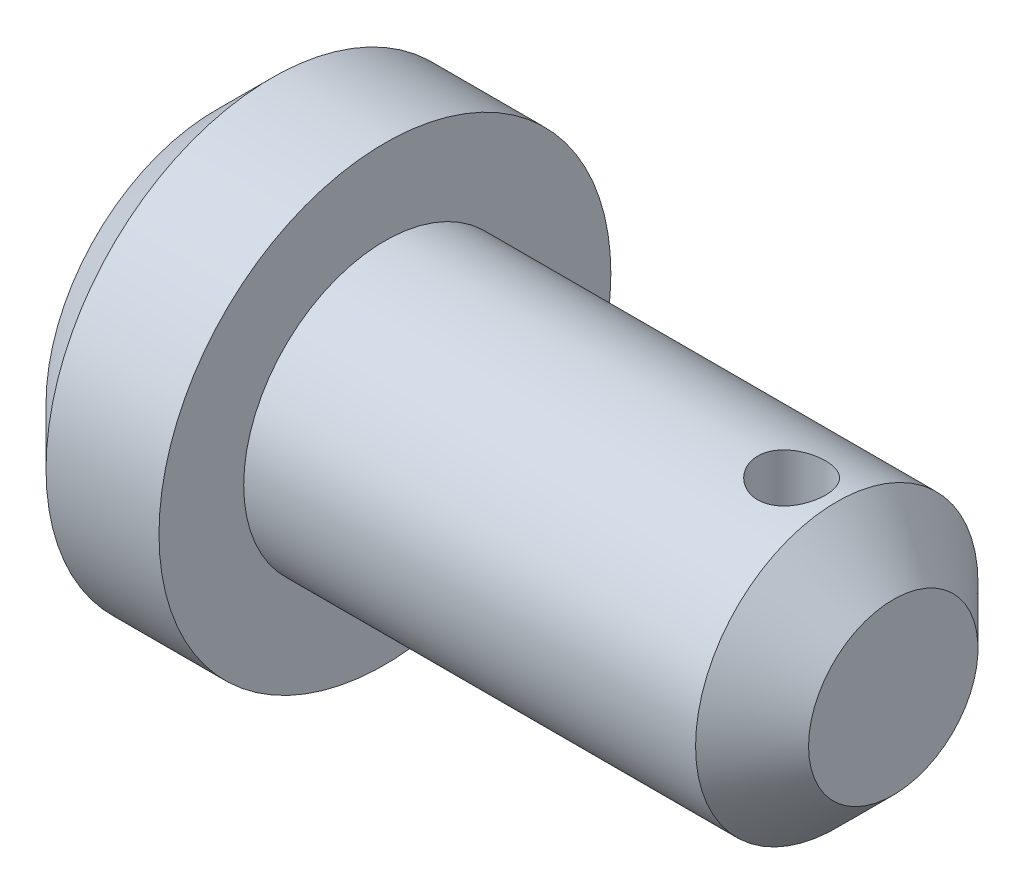
ISO-10303-21;
HEADER;
FILE_DESCRIPTION(('STEP AP214'),'2;1');
FILE_NAME('part.step','',(''),(''),'','','');
FILE_SCHEMA(('AUTOMOTIVE_DESIGN { 1 0 10303 214 1 1 1 1 }'));
ENDSEC;
DATA;
#1=APPLICATION_CONTEXT('core data for automotive mechanical design processes');
#2=APPLICATION_PROTOCOL_DEFINITION('international standard','automotive_design',2000,#1);
#3=PRODUCT_CONTEXT('',#1,'mechanical');
#4=PRODUCT('Part','Part','',(#3));
#5=PRODUCT_RELATED_PRODUCT_CATEGORY('part','',(#4));
#6=PRODUCT_DEFINITION_FORMATION('','',#4);
#7=PRODUCT_DEFINITION_CONTEXT('part definition',#1,'design');
#8=PRODUCT_DEFINITION('design','',#6,#7);
#9=PRODUCT_DEFINITION_SHAPE('','',#8);
#10=(LENGTH_UNIT() NAMED_UNIT(*) SI_UNIT(.MILLI.,.METRE.));
#11=(NAMED_UNIT(*) PLANE_ANGLE_UNIT() SI_UNIT($,.RADIAN.));
#12=(NAMED_UNIT(*) SI_UNIT($,.STERADIAN.) SOLID_ANGLE_UNIT());
#13=UNCERTAINTY_MEASURE_WITH_UNIT(LENGTH_MEASURE(1.E-05),#10,'distance_accuracy_value','');
#14=(GEOMETRIC_REPRESENTATION_CONTEXT(3) GLOBAL_UNCERTAINTY_ASSIGNED_CONTEXT((#13)) GLOBAL_UNIT_ASSIGNED_CONTEXT((#10,
#11,#12)) REPRESENTATION_CONTEXT('',''));
#15=CARTESIAN_POINT('',(0.,0.,0.));
#16=DIRECTION('',(0.,0.,1.));
#17=DIRECTION('',(1.,0.,0.));
#18=AXIS2_PLACEMENT_3D('',#15,#16,#17);
#19=CARTESIAN_POINT('',(-58.2352941176471,30.,0.));
#20=DIRECTION('',(1.,0.,0.));
#21=DIRECTION('',(0.,0.,-1.));
#22=AXIS2_PLACEMENT_3D('',#19,#20,#21);
#23=PLANE('',#22);
#24=CARTESIAN_POINT('',(-58.235294117647,0.,0.));
#25=DIRECTION('',(-1.,0.,0.));
#26=DIRECTION('',(0.,0.,1.));
#27=AXIS2_PLACEMENT_3D('',#24,#25,#26);
#28=CIRCLE('',#27,30.);
#29=CARTESIAN_POINT('',(-58.235294117647,0.,30.));
#30=VERTEX_POINT('',#29);
#31=EDGE_CURVE('E110',#30,#30,#28,.T.);
#32=ORIENTED_EDGE('',*,*,#31,.T.);
#33=EDGE_LOOP('',(#32));
#34=FACE_BOUND('',#33,.T.);
#35=ADVANCED_FACE('F45',(#34),#23,.F.);
#36=CARTESIAN_POINT('',(61.764705882353,0.,0.));
#37=DIRECTION('',(-1.,0.,0.));
#38=DIRECTION('',(0.,0.,1.));
#39=AXIS2_PLACEMENT_3D('',#36,#37,#38);
#40=PLANE('',#39);
#41=CARTESIAN_POINT('',(61.764705882353,0.,0.));
#42=DIRECTION('',(-1.,0.,0.));
#43=DIRECTION('',(0.,0.,1.));
#44=AXIS2_PLACEMENT_3D('',#41,#42,#43);
#45=CIRCLE('',#44,15.);
#46=CARTESIAN_POINT('',(61.764705882353,0.,15.));
#47=VERTEX_POINT('',#46);
#48=EDGE_CURVE('E10',#47,#47,#45,.T.);
#49=ORIENTED_EDGE('',*,*,#48,.F.);
#50=EDGE_LOOP('',(#49));
#51=FACE_BOUND('',#50,.T.);
#52=ADVANCED_FACE('F102',(#51),#40,.F.);
#53=CARTESIAN_POINT('',(61.764705882353,0.,0.));
#54=DIRECTION('',(-1.,0.,0.));
#55=DIRECTION('',(0.,0.,1.));
#56=AXIS2_PLACEMENT_3D('',#53,#54,#55);
#57=CONICAL_SURFACE('',#56,15.,0.785398163397449);
#58=CARTESIAN_POINT('',(51.764705882353,0.,0.));
#59=DIRECTION('',(-1.,0.,0.));
#60=DIRECTION('',(0.,0.,1.));
#61=AXIS2_PLACEMENT_3D('',#58,#59,#60);
#62=CIRCLE('',#61,25.);
#63=CARTESIAN_POINT('',(51.764705882353,0.,25.));
#64=VERTEX_POINT('',#63);
#65=EDGE_CURVE('E58',#64,#64,#62,.T.);
#66=ORIENTED_EDGE('',*,*,#65,.F.);
#67=EDGE_LOOP('',(#66));
#68=FACE_BOUND('',#67,.T.);
#69=ORIENTED_EDGE('',*,*,#48,.T.);
#70=EDGE_LOOP('',(#69));
#71=FACE_BOUND('',#70,.T.);
#72=ADVANCED_FACE('F97',(#68,#71),#57,.T.);
#73=CARTESIAN_POINT('',(-58.2352941176471,0.,0.));
#74=DIRECTION('',(-1.,0.,0.));
#75=DIRECTION('',(0.,0.,1.));
#76=AXIS2_PLACEMENT_3D('',#73,#74,#75);
#77=CYLINDRICAL_SURFACE('',#76,25.);
#78=CARTESIAN_POINT('',(43.764705882353,-24.2693221990232,6.));
#79=CARTESIAN_POINT('',(43.9306461499323,-24.2693192173439,6.00000460058749));
#80=CARTESIAN_POINT('',(44.0965349544905,-24.2710270328908,5.99311472313627));
#81=CARTESIAN_POINT('',(44.4271510845846,-24.2777997433195,5.96562344868169));
#82=CARTESIAN_POINT('',(44.5918782603941,-24.2828650632483,5.94502031563237));
#83=CARTESIAN_POINT('',(44.9189848875476,-24.2962060432289,5.89025958920488));
#84=CARTESIAN_POINT('',(45.081363459721,-24.304482874777,5.85609704951731));
#85=CARTESIAN_POINT('',(45.4026282056471,-24.324002012079,5.77448580831014));
#86=CARTESIAN_POINT('',(45.561513065448,-24.3352454135442,5.72703219729494));
#87=CARTESIAN_POINT('',(45.8743714150501,-24.360345033975,5.61930954739399));
#88=CARTESIAN_POINT('',(46.0283524441402,-24.3741969907612,5.55906139358703));
#89=CARTESIAN_POINT('',(46.3306948292698,-24.4041320001377,5.42613868912028));
#90=CARTESIAN_POINT('',(46.4790540846896,-24.420215876438,5.35345954837854));
#91=CARTESIAN_POINT('',(46.7690675207731,-24.4541500249133,5.19624934621714));
#92=CARTESIAN_POINT('',(46.9107241861786,-24.471999634801,5.11172272360157));
#93=CARTESIAN_POINT('',(47.1865364336345,-24.5089827826596,4.93135257338601));
#94=CARTESIAN_POINT('',(47.3206891710384,-24.5281168015673,4.83550479634857));
#95=CARTESIAN_POINT('',(47.5829186525761,-24.5674915774464,4.63134479435269));
#96=CARTESIAN_POINT('',(47.7108434537073,-24.5877460219987,4.52284000132129));
#97=CARTESIAN_POINT('',(47.9571904319463,-24.628482704143,4.29548353417838));
#98=CARTESIAN_POINT('',(48.0756090652001,-24.6489650234755,4.17662803548194));
#99=CARTESIAN_POINT('',(48.3020765677449,-24.6895792444555,3.92942214664514));
#100=CARTESIAN_POINT('',(48.4101282952854,-24.7097112414296,3.80107439098764));
#101=CARTESIAN_POINT('',(48.6152046472597,-24.749084932891,3.53564701496838));
#102=CARTESIAN_POINT('',(48.7122251948699,-24.7683262966769,3.39856419538247));
#103=CARTESIAN_POINT('',(48.8956503307429,-24.805612728147,3.11485061597086));
#104=CARTESIAN_POINT('',(48.9819076047794,-24.8236399057151,2.96812218206264));
#105=CARTESIAN_POINT('',(49.1417592916474,-24.8577272433076,2.66763492888514));
#106=CARTESIAN_POINT('',(49.2153489250682,-24.8737866602544,2.51387348368351));
#107=CARTESIAN_POINT('',(49.3492191485298,-24.9034639147108,2.20050084057474));
#108=CARTESIAN_POINT('',(49.4095060792765,-24.917082914856,2.04089247207776));
#109=CARTESIAN_POINT('',(49.5163409431724,-24.9415044760467,1.71693448898556));
#110=CARTESIAN_POINT('',(49.5628839311911,-24.9523060231976,1.55258319115473));
#111=CARTESIAN_POINT('',(49.6797147224069,-24.9796180760798,1.06042675145321));
#112=CARTESIAN_POINT('',(49.7298815358237,-24.9916494382249,0.727223064781644));
#113=CARTESIAN_POINT('',(49.7628460600211,-24.9995546719704,0.225051972672744));
#114=CARTESIAN_POINT('',(49.7667798362233,-25.0004978214515,0.0572008556931702));
#115=CARTESIAN_POINT('',(49.7605958457296,-24.9990135577545,-0.278247999700315));
#116=CARTESIAN_POINT('',(49.750477905138,-24.9965861028638,-0.445845734952831));
#117=CARTESIAN_POINT('',(49.6997801568796,-24.9844710986104,-0.939451198306497));
#118=CARTESIAN_POINT('',(49.6393121632639,-24.9700581884779,-1.26352376365918));
#119=CARTESIAN_POINT('',(49.4665219571564,-24.9299774285752,-1.8966100087818));
#120=CARTESIAN_POINT('',(49.3541971112851,-24.9043090072343,-2.20562292291579));
#121=CARTESIAN_POINT('',(49.0799323387454,-24.8441871252282,-2.80308340285013));
#122=CARTESIAN_POINT('',(48.9175794035077,-24.8096609520016,-3.09133416391587));
#123=CARTESIAN_POINT('',(48.5481789823236,-24.7355808399422,-3.63689114777194));
#124=CARTESIAN_POINT('',(48.341124271936,-24.6960260888452,-3.89419235819687));
#125=CARTESIAN_POINT('',(47.8820750892758,-24.6150468786432,-4.37733250714646));
#126=CARTESIAN_POINT('',(47.6290871524865,-24.5736003966327,-4.60222487048294));
#127=CARTESIAN_POINT('',(47.0885546075646,-24.4944202534268,-5.00659136952867));
#128=CARTESIAN_POINT('',(46.8010086337529,-24.4566867390692,-5.18606370943939));
#129=CARTESIAN_POINT('',(46.1977753706163,-24.3891322466935,-5.4950396533725));
#130=CARTESIAN_POINT('',(45.8819757808872,-24.3593449045093,-5.62433186444417));
#131=CARTESIAN_POINT('',(45.2322396349259,-24.3114966451334,-5.82770650444349));
#132=CARTESIAN_POINT('',(44.8983066314554,-24.2934334398264,-5.90179970658057));
#133=CARTESIAN_POINT('',(44.2305191237201,-24.2715545321338,-5.99113700492853));
#134=CARTESIAN_POINT('',(43.8968617428008,-24.2674017566251,-6.00777368474904));
#135=CARTESIAN_POINT('',(43.2315394887343,-24.2728991225919,-5.98552405004056));
#136=CARTESIAN_POINT('',(42.8998744503728,-24.2825481032417,-5.9466424049974));
#137=CARTESIAN_POINT('',(42.2530140679022,-24.3142403018894,-5.81567711192227));
#138=CARTESIAN_POINT('',(41.9376476049011,-24.3360979424442,-5.7243894954131));
#139=CARTESIAN_POINT('',(41.3266901666286,-24.3895714349639,-5.49207803402932));
#140=CARTESIAN_POINT('',(41.0311013939784,-24.421188371618,-5.35104866039818));
#141=CARTESIAN_POINT('',(40.4621486605068,-24.491337816706,-5.0202958832683));
#142=CARTESIAN_POINT('',(40.1892881977641,-24.5299859071541,-4.82973151657672));
#143=CARTESIAN_POINT('',(39.6789033509813,-24.609553113729,-4.40637723136317));
#144=CARTESIAN_POINT('',(39.4413843083727,-24.6504725718652,-4.17358094176829));
#145=CARTESIAN_POINT('',(39.0028799259293,-24.7311017019711,-3.66607172916322));
#146=CARTESIAN_POINT('',(38.8028536945154,-24.770762345906,-3.3905223617437));
#147=CARTESIAN_POINT('',(38.4518736328202,-24.8434406642277,-2.80874047615626));
#148=CARTESIAN_POINT('',(38.300917307953,-24.8764586762762,-2.50250951879602));
#149=CARTESIAN_POINT('',(38.1153414299562,-24.9181020803639,-2.02815096730083));
#150=CARTESIAN_POINT('',(38.0603976383018,-24.9306431435962,-1.86803584664665));
#151=CARTESIAN_POINT('',(37.9641905159392,-24.9528307363167,-1.5435669629554));
#152=CARTESIAN_POINT('',(37.9229220563691,-24.9624783508485,-1.37921481397561));
#153=CARTESIAN_POINT('',(37.8544155710539,-24.9785993962541,-1.04746058126016));
#154=CARTESIAN_POINT('',(37.8271782543408,-24.9850726667189,-0.880058343837646));
#155=CARTESIAN_POINT('',(37.7869656967812,-24.9946592960451,-0.543455945222837));
#156=CARTESIAN_POINT('',(37.7739898435932,-24.997772799164,-0.374255861539258));
#157=CARTESIAN_POINT('',(37.7625588715036,-25.0005148115007,-0.0395721662636039));
#158=CARTESIAN_POINT('',(37.7637493121304,-25.0002283873103,0.125898766906475));
#159=CARTESIAN_POINT('',(37.7797859816443,-24.9963838456846,0.456136647513654));
#160=CARTESIAN_POINT('',(37.7946319142076,-24.9928257992435,0.620903610148951));
#161=CARTESIAN_POINT('',(37.8378586224235,-24.9825354772041,0.948575696498024));
#162=CARTESIAN_POINT('',(37.866241434379,-24.9758027240481,1.11148053632312));
#163=CARTESIAN_POINT('',(37.9362970722175,-24.9593507893913,1.43419100404799));
#164=CARTESIAN_POINT('',(37.9779651863338,-24.9496326667266,1.59399770944887));
#165=CARTESIAN_POINT('',(38.074055129064,-24.9275215666658,1.90878490028135));
#166=CARTESIAN_POINT('',(38.1284215653486,-24.9151402247435,2.06378312590838));
#167=CARTESIAN_POINT('',(38.2495670294664,-24.8880146824749,2.3685707959777));
#168=CARTESIAN_POINT('',(38.3163417194494,-24.8732713081285,2.51836203909182));
#169=CARTESIAN_POINT('',(38.4618583151318,-24.841802398867,2.81187682420641));
#170=CARTESIAN_POINT('',(38.5406054199167,-24.8250760035128,2.95559769529925));
#171=CARTESIAN_POINT('',(38.7094625725609,-24.7900921246488,3.23593617076045));
#172=CARTESIAN_POINT('',(38.7995688389214,-24.7718351513474,3.37255611776949));
#173=CARTESIAN_POINT('',(38.9927284597949,-24.7338351675459,3.64090348698623));
#174=CARTESIAN_POINT('',(39.0960293956952,-24.7140678232284,3.77244930795077));
#175=CARTESIAN_POINT('',(39.3131611130006,-24.6739715765701,4.02636882328124));
#176=CARTESIAN_POINT('',(39.4269882762308,-24.6536428688592,4.14874564331391));
#177=CARTESIAN_POINT('',(39.6645212729517,-24.6129603609016,4.38365180469934));
#178=CARTESIAN_POINT('',(39.7882330139467,-24.5926065529162,4.49617517167718));
#179=CARTESIAN_POINT('',(40.0446205206804,-24.5524543239015,4.71050671781096));
#180=CARTESIAN_POINT('',(40.1772930120758,-24.532655703704,4.81231877656933));
#181=CARTESIAN_POINT('',(40.4531432558612,-24.4938254842292,5.00624248933444));
#182=CARTESIAN_POINT('',(40.5964627458547,-24.474813007441,5.09815651544129));
#183=CARTESIAN_POINT('',(40.8905001906618,-24.4384897622653,5.26952462166943));
#184=CARTESIAN_POINT('',(41.0412153967742,-24.4211783687267,5.34898328559685));
#185=CARTESIAN_POINT('',(41.3489885983494,-24.3887740639133,5.49484184745972));
#186=CARTESIAN_POINT('',(41.506043517432,-24.3736800927344,5.56124798952492));
#187=CARTESIAN_POINT('',(41.8253903644842,-24.3461620490209,5.6805037284954));
#188=CARTESIAN_POINT('',(41.9876814414929,-24.3337375451432,5.7333555158345));
#189=CARTESIAN_POINT('',(42.4137614795976,-24.3054947105592,5.85223691155717));
#190=CARTESIAN_POINT('',(42.6807794743786,-24.2920191452793,5.90755575023753));
#191=CARTESIAN_POINT('',(43.2201466900256,-24.2739356520306,5.98143220718613));
#192=CARTESIAN_POINT('',(43.4924955284105,-24.2693270902047,5.99999245314254));
#193=CARTESIAN_POINT('',(43.764705882353,-24.2693221990232,6.));
#194=B_SPLINE_CURVE_WITH_KNOTS('',3,(#78,#79,#80,#81,#82,#83,#84,#85,#86,#87,#88,#89,#90,#91,
#92,#93,#94,#95,#96,#97,#98,#99,#100,#101,#102,#103,#104,#105,#106,#107,#108,#109,#110,#111,
#112,#113,#114,#115,#116,#117,#118,#119,#120,#121,#122,#123,#124,#125,#126,#127,#128,#129,#130,
#131,#132,#133,#134,#135,#136,#137,#138,#139,#140,#141,#142,#143,#144,#145,#146,#147,#148,#149,
#150,#151,#152,#153,#154,#155,#156,#157,#158,#159,#160,#161,#162,#163,#164,#165,#166,#167,#168,
#169,#170,#171,#172,#173,#174,#175,#176,#177,#178,#179,#180,#181,#182,#183,#184,#185,#186,#187,
#188,#189,#190,#191,#192,#193),.UNSPECIFIED.,.T.,.F.,(4,2,2,2,2,2,2,2,2,2,2,2,2,2,2,2,2,2,2,2,2,
2,2,2,2,2,2,2,2,2,2,2,2,2,2,2,2,2,2,2,2,2,2,2,2,2,2,2,2,2,2,2,2,2,2,2,2,4),(0.,
0.497580591380397,0.995224186553663,1.49304948324961,1.99105891120688,2.48826158123243,
2.98564823885731,3.4828490401512,3.98023706425766,4.48653742340698,4.99302566076186,
5.49937385101409,6.00590856964271,6.51875380835026,7.03179211782623,7.5445853578556,
8.0575628789423,9.06317072582739,9.56637068685641,10.0695768752428,11.0544731736285,
12.0394194922331,13.0327253814724,14.0261919233719,15.0444773123883,16.0628029556731,
17.0853730875996,18.1077435918425,19.1051538629732,20.10248024975,21.0850439079104,
22.0677168116698,23.0683069952269,24.0690482527067,25.0926627677996,26.1162252368616,
26.624940138715,27.1334640332021,27.6420136222755,28.150541375013,28.6463730888495,
29.1421940434048,29.6380896060201,30.1338094895388,30.6274060608767,31.1208303973833,
31.6144696213305,32.1079449431356,32.6126284711583,33.1171391648262,33.6219536669565,
34.1265846927702,34.6399206216221,35.1530671874622,35.6659676710412,36.1787852157025,
36.9950805869967,37.8113176033061),.UNSPECIFIED.);
#195=CARTESIAN_POINT('',(43.764705882353,-24.2693221990232,6.));
#196=VERTEX_POINT('',#195);
#197=EDGE_CURVE('E48',#196,#196,#194,.T.);
#198=ORIENTED_EDGE('',*,*,#197,.T.);
#199=EDGE_LOOP('',(#198));
#200=FACE_BOUND('',#199,.T.);
#201=CARTESIAN_POINT('',(43.764705882353,24.2693221990232,6.));
#202=CARTESIAN_POINT('',(43.5987656147736,24.2693192173439,6.00000460058749));
#203=CARTESIAN_POINT('',(43.4328768102154,24.2710270328908,5.99311472313627));
#204=CARTESIAN_POINT('',(43.1022606801213,24.2777997433195,5.96562344868169));
#205=CARTESIAN_POINT('',(42.9375335043118,24.2828650632483,5.94502031563237));
#206=CARTESIAN_POINT('',(42.6104268771583,24.2962060432289,5.89025958920488));
#207=CARTESIAN_POINT('',(42.4480483049849,24.304482874777,5.85609704951731));
#208=CARTESIAN_POINT('',(42.1267835590588,24.324002012079,5.77448580831014));
#209=CARTESIAN_POINT('',(41.9678986992579,24.3352454135442,5.72703219729494));
#210=CARTESIAN_POINT('',(41.6550403496558,24.360345033975,5.61930954739399));
#211=CARTESIAN_POINT('',(41.5010593205657,24.3741969907612,5.55906139358703));
#212=CARTESIAN_POINT('',(41.1987169354361,24.4041320001377,5.42613868912028));
#213=CARTESIAN_POINT('',(41.0503576800163,24.420215876438,5.35345954837854));
#214=CARTESIAN_POINT('',(40.7603442439328,24.4541500249133,5.19624934621714));
#215=CARTESIAN_POINT('',(40.6186875785274,24.471999634801,5.11172272360157));
#216=CARTESIAN_POINT('',(40.3428753310714,24.5089827826596,4.93135257338601));
#217=CARTESIAN_POINT('',(40.2087225936675,24.5281168015673,4.83550479634857));
#218=CARTESIAN_POINT('',(39.9464931121298,24.5674915774464,4.63134479435269));
#219=CARTESIAN_POINT('',(39.8185683109987,24.5877460219987,4.52284000132129));
#220=CARTESIAN_POINT('',(39.5722213327596,24.628482704143,4.29548353417838));
#221=CARTESIAN_POINT('',(39.4538026995058,24.6489650234755,4.17662803548194));
#222=CARTESIAN_POINT('',(39.2273351969611,24.6895792444555,3.92942214664514));
#223=CARTESIAN_POINT('',(39.1192834694205,24.7097112414296,3.80107439098764));
#224=CARTESIAN_POINT('',(38.9142071174462,24.749084932891,3.53564701496838));
#225=CARTESIAN_POINT('',(38.817186569836,24.7683262966769,3.39856419538247));
#226=CARTESIAN_POINT('',(38.633761433963,24.805612728147,3.11485061597086));
#227=CARTESIAN_POINT('',(38.5475041599265,24.8236399057151,2.96812218206264));
#228=CARTESIAN_POINT('',(38.3876524730585,24.8577272433076,2.66763492888514));
#229=CARTESIAN_POINT('',(38.3140628396377,24.8737866602544,2.51387348368352));
#230=CARTESIAN_POINT('',(38.1801926161761,24.9034639147108,2.20050084057475));
#231=CARTESIAN_POINT('',(38.1199056854294,24.917082914856,2.04089247207776));
#232=CARTESIAN_POINT('',(38.0130708215335,24.9415044760467,1.71693448898556));
#233=CARTESIAN_POINT('',(37.9665278335148,24.9523060231976,1.55258319115473));
#234=CARTESIAN_POINT('',(37.849697042299,24.9796180760798,1.06042675145321));
#235=CARTESIAN_POINT('',(37.7995302288822,24.9916494382249,0.727223064781644));
#236=CARTESIAN_POINT('',(37.7665657046848,24.9995546719704,0.225051972672744));
#237=CARTESIAN_POINT('',(37.7626319284826,25.0004978214515,0.0572008556931703));
#238=CARTESIAN_POINT('',(37.7688159189763,24.9990135577545,-0.278247999700315));
#239=CARTESIAN_POINT('',(37.7789338595679,24.9965861028638,-0.445845734952831));
#240=CARTESIAN_POINT('',(37.8296316078263,24.9844710986104,-0.939451198306497));
#241=CARTESIAN_POINT('',(37.890099601442,24.9700581884779,-1.26352376365918));
#242=CARTESIAN_POINT('',(38.0628898075495,24.9299774285752,-1.8966100087818));
#243=CARTESIAN_POINT('',(38.1752146534209,24.9043090072343,-2.20562292291579));
#244=CARTESIAN_POINT('',(38.4494794259605,24.8441871252282,-2.80308340285013));
#245=CARTESIAN_POINT('',(38.6118323611982,24.8096609520016,-3.09133416391587));
#246=CARTESIAN_POINT('',(38.9812327823823,24.7355808399422,-3.63689114777194));
#247=CARTESIAN_POINT('',(39.1882874927699,24.6960260888452,-3.89419235819687));
#248=CARTESIAN_POINT('',(39.6473366754301,24.6150468786432,-4.37733250714646));
#249=CARTESIAN_POINT('',(39.9003246122194,24.5736003966327,-4.60222487048294));
#250=CARTESIAN_POINT('',(40.4408571571413,24.4944202534268,-5.00659136952867));
#251=CARTESIAN_POINT('',(40.728403130953,24.4566867390692,-5.18606370943939));
#252=CARTESIAN_POINT('',(41.3316363940896,24.3891322466935,-5.4950396533725));
#253=CARTESIAN_POINT('',(41.6474359838188,24.3593449045093,-5.62433186444417));
#254=CARTESIAN_POINT('',(42.29717212978,24.3114966451334,-5.82770650444349));
#255=CARTESIAN_POINT('',(42.6311051332505,24.2934334398264,-5.90179970658057));
#256=CARTESIAN_POINT('',(43.2988926409859,24.2715545321338,-5.99113700492853));
#257=CARTESIAN_POINT('',(43.6325500219051,24.2674017566251,-6.00777368474904));
#258=CARTESIAN_POINT('',(44.2978722759716,24.2728991225919,-5.98552405004056));
#259=CARTESIAN_POINT('',(44.6295373143331,24.2825481032417,-5.9466424049974));
#260=CARTESIAN_POINT('',(45.2763976968037,24.3142403018894,-5.81567711192227));
#261=CARTESIAN_POINT('',(45.5917641598048,24.3360979424442,-5.7243894954131));
#262=CARTESIAN_POINT('',(46.2027215980773,24.3895714349639,-5.49207803402932));
#263=CARTESIAN_POINT('',(46.4983103707275,24.421188371618,-5.35104866039818));
#264=CARTESIAN_POINT('',(47.0672631041991,24.491337816706,-5.0202958832683));
#265=CARTESIAN_POINT('',(47.3401235669418,24.5299859071541,-4.82973151657672));
#266=CARTESIAN_POINT('',(47.8505084137246,24.609553113729,-4.40637723136317));
#267=CARTESIAN_POINT('',(48.0880274563332,24.6504725718652,-4.17358094176829));
#268=CARTESIAN_POINT('',(48.5265318387766,24.7311017019711,-3.66607172916322));
#269=CARTESIAN_POINT('',(48.7265580701905,24.770762345906,-3.3905223617437));
#270=CARTESIAN_POINT('',(49.0775381318857,24.8434406642277,-2.80874047615626));
#271=CARTESIAN_POINT('',(49.2284944567529,24.8764586762762,-2.50250951879602));
#272=CARTESIAN_POINT('',(49.4140703347498,24.9181020803639,-2.02815096730083));
#273=CARTESIAN_POINT('',(49.4690141264041,24.9306431435962,-1.86803584664665));
#274=CARTESIAN_POINT('',(49.5652212487668,24.9528307363167,-1.5435669629554));
#275=CARTESIAN_POINT('',(49.6064897083368,24.9624783508485,-1.37921481397561));
#276=CARTESIAN_POINT('',(49.674996193652,24.9785993962541,-1.04746058126016));
#277=CARTESIAN_POINT('',(49.7022335103651,24.9850726667189,-0.880058343837644));
#278=CARTESIAN_POINT('',(49.7424460679248,24.9946592960451,-0.543455945222834));
#279=CARTESIAN_POINT('',(49.7554219211127,24.997772799164,-0.374255861539256));
#280=CARTESIAN_POINT('',(49.7668528932024,25.0005148115007,-0.0395721662636028));
#281=CARTESIAN_POINT('',(49.7656624525755,25.0002283873103,0.125898766906477));
#282=CARTESIAN_POINT('',(49.7496257830616,24.9963838456846,0.456136647513656));
#283=CARTESIAN_POINT('',(49.7347798504983,24.9928257992435,0.620903610148952));
#284=CARTESIAN_POINT('',(49.6915531422824,24.9825354772041,0.948575696498024));
#285=CARTESIAN_POINT('',(49.6631703303269,24.9758027240481,1.11148053632312));
#286=CARTESIAN_POINT('',(49.5931146924884,24.9593507893913,1.43419100404799));
#287=CARTESIAN_POINT('',(49.5514465783721,24.9496326667266,1.59399770944887));
#288=CARTESIAN_POINT('',(49.4553566356419,24.9275215666658,1.90878490028135));
#289=CARTESIAN_POINT('',(49.4009901993573,24.9151402247435,2.06378312590839));
#290=CARTESIAN_POINT('',(49.2798447352395,24.8880146824749,2.36857079597771));
#291=CARTESIAN_POINT('',(49.2130700452565,24.8732713081285,2.51836203909183));
#292=CARTESIAN_POINT('',(49.0675534495741,24.841802398867,2.81187682420641));
#293=CARTESIAN_POINT('',(48.9888063447893,24.8250760035128,2.95559769529925));
#294=CARTESIAN_POINT('',(48.8199491921451,24.7900921246488,3.23593617076045));
#295=CARTESIAN_POINT('',(48.7298429257845,24.7718351513474,3.37255611776949));
#296=CARTESIAN_POINT('',(48.536683304911,24.7338351675459,3.64090348698623));
#297=CARTESIAN_POINT('',(48.4333823690107,24.7140678232284,3.77244930795078));
#298=CARTESIAN_POINT('',(48.2162506517053,24.6739715765701,4.02636882328125));
#299=CARTESIAN_POINT('',(48.1024234884751,24.6536428688592,4.14874564331392));
#300=CARTESIAN_POINT('',(47.8648904917542,24.6129603609016,4.38365180469935));
#301=CARTESIAN_POINT('',(47.7411787507592,24.5926065529162,4.49617517167718));
#302=CARTESIAN_POINT('',(47.4847912440255,24.5524543239015,4.71050671781096));
#303=CARTESIAN_POINT('',(47.3521187526302,24.532655703704,4.81231877656933));
#304=CARTESIAN_POINT('',(47.0762685088448,24.4938254842292,5.00624248933444));
#305=CARTESIAN_POINT('',(46.9329490188512,24.474813007441,5.09815651544129));
#306=CARTESIAN_POINT('',(46.6389115740441,24.4384897622653,5.26952462166943));
#307=CARTESIAN_POINT('',(46.4881963679317,24.4211783687267,5.34898328559685));
#308=CARTESIAN_POINT('',(46.1804231663565,24.3887740639133,5.49484184745972));
#309=CARTESIAN_POINT('',(46.0233682472739,24.3736800927344,5.56124798952492));
#310=CARTESIAN_POINT('',(45.7040214002217,24.3461620490209,5.6805037284954));
#311=CARTESIAN_POINT('',(45.541730323213,24.3337375451432,5.7333555158345));
#312=CARTESIAN_POINT('',(45.1156502851083,24.3054947105592,5.85223691155717));
#313=CARTESIAN_POINT('',(44.8486322903273,24.2920191452793,5.90755575023753));
#314=CARTESIAN_POINT('',(44.3092650746803,24.2739356520306,5.98143220718613));
#315=CARTESIAN_POINT('',(44.0369162362955,24.2693270902047,5.99999245314254));
#316=CARTESIAN_POINT('',(43.764705882353,24.2693221990232,6.));
#317=B_SPLINE_CURVE_WITH_KNOTS('',3,(#201,#202,#203,#204,#205,#206,#207,#208,#209,#210,#211,
#212,#213,#214,#215,#216,#217,#218,#219,#220,#221,#222,#223,#224,#225,#226,#227,#228,#229,#230,
#231,#232,#233,#234,#235,#236,#237,#238,#239,#240,#241,#242,#243,#244,#245,#246,#247,#248,#249,
#250,#251,#252,#253,#254,#255,#256,#257,#258,#259,#260,#261,#262,#263,#264,#265,#266,#267,#268,
#269,#270,#271,#272,#273,#274,#275,#276,#277,#278,#279,#280,#281,#282,#283,#284,#285,#286,#287,
#288,#289,#290,#291,#292,#293,#294,#295,#296,#297,#298,#299,#300,#301,#302,#303,#304,#305,#306,
#307,#308,#309,#310,#311,#312,#313,#314,#315,#316),.UNSPECIFIED.,.T.,.F.,(4,2,2,2,2,2,2,2,2,2,2,
2,2,2,2,2,2,2,2,2,2,2,2,2,2,2,2,2,2,2,2,2,2,2,2,2,2,2,2,2,2,2,2,2,2,2,2,2,2,2,2,2,2,2,2,2,2,4),
(0.,0.497580591380397,0.995224186553663,1.49304948324961,1.99105891120688,2.48826158123243,
2.98564823885731,3.4828490401512,3.98023706425766,4.48653742340698,4.99302566076186,
5.49937385101409,6.00590856964271,6.51875380835025,7.03179211782623,7.5445853578556,
8.0575628789423,9.06317072582739,9.56637068685641,10.0695768752428,11.0544731736285,
12.0394194922331,13.0327253814724,14.0261919233719,15.0444773123883,16.0628029556731,
17.0853730875996,18.1077435918426,19.1051538629732,20.10248024975,21.0850439079104,
22.0677168116698,23.0683069952269,24.0690482527067,25.0926627677996,26.1162252368616,
26.624940138715,27.1334640332021,27.6420136222755,28.150541375013,28.6463730888496,
29.1421940434048,29.6380896060201,30.1338094895388,30.6274060608767,31.1208303973833,
31.6144696213306,32.1079449431356,32.6126284711584,33.1171391648262,33.6219536669565,
34.1265846927702,34.6399206216221,35.1530671874622,35.6659676710412,36.1787852157025,
36.9950805869967,37.8113176033061),.UNSPECIFIED.);
#318=CARTESIAN_POINT('',(43.764705882353,24.2693221990232,6.));
#319=VERTEX_POINT('',#318);
#320=EDGE_CURVE('E67',#319,#319,#317,.T.);
#321=ORIENTED_EDGE('',*,*,#320,.T.);
#322=EDGE_LOOP('',(#321));
#323=FACE_BOUND('',#322,.T.);
#324=CARTESIAN_POINT('',(-28.235294117647,0.,0.));
#325=DIRECTION('',(-1.,0.,0.));
#326=DIRECTION('',(0.,0.,1.));
#327=AXIS2_PLACEMENT_3D('',#324,#325,#326);
#328=CIRCLE('',#327,25.);
#329=CARTESIAN_POINT('',(-28.235294117647,0.,25.));
#330=VERTEX_POINT('',#329);
#331=EDGE_CURVE('E64',#330,#330,#328,.T.);
#332=ORIENTED_EDGE('',*,*,#331,.F.);
#333=EDGE_LOOP('',(#332));
#334=FACE_BOUND('',#333,.T.);
#335=ORIENTED_EDGE('',*,*,#65,.T.);
#336=EDGE_LOOP('',(#335));
#337=FACE_BOUND('',#336,.T.);
#338=ADVANCED_FACE('F73',(#200,#323,#334,#337),#77,.T.);
#339=CARTESIAN_POINT('',(-28.235294117647,25.,0.));
#340=DIRECTION('',(-1.,0.,0.));
#341=DIRECTION('',(0.,0.,1.));
#342=AXIS2_PLACEMENT_3D('',#339,#340,#341);
#343=PLANE('',#342);
#344=CARTESIAN_POINT('',(-28.235294117647,0.,0.));
#345=DIRECTION('',(-1.,0.,0.));
#346=DIRECTION('',(0.,0.,1.));
#347=AXIS2_PLACEMENT_3D('',#344,#345,#346);
#348=CIRCLE('',#347,40.);
#349=CARTESIAN_POINT('',(-28.235294117647,0.,40.));
#350=VERTEX_POINT('',#349);
#351=EDGE_CURVE('E117',#350,#350,#348,.T.);
#352=ORIENTED_EDGE('',*,*,#351,.F.);
#353=EDGE_LOOP('',(#352));
#354=FACE_BOUND('',#353,.T.);
#355=ORIENTED_EDGE('',*,*,#331,.T.);
#356=EDGE_LOOP('',(#355));
#357=FACE_BOUND('',#356,.T.);
#358=ADVANCED_FACE('F89',(#354,#357),#343,.F.);
#359=CARTESIAN_POINT('',(-58.2352941176471,0.,0.));
#360=DIRECTION('',(-1.,0.,0.));
#361=DIRECTION('',(0.,0.,1.));
#362=AXIS2_PLACEMENT_3D('',#359,#360,#361);
#363=CYLINDRICAL_SURFACE('',#362,40.);
#364=CARTESIAN_POINT('',(-48.235294117647,0.,0.));
#365=DIRECTION('',(-1.,0.,0.));
#366=DIRECTION('',(0.,0.,1.));
#367=AXIS2_PLACEMENT_3D('',#364,#365,#366);
#368=CIRCLE('',#367,40.);
#369=CARTESIAN_POINT('',(-48.235294117647,0.,40.));
#370=VERTEX_POINT('',#369);
#371=EDGE_CURVE('E112',#370,#370,#368,.T.);
#372=ORIENTED_EDGE('',*,*,#371,.F.);
#373=EDGE_LOOP('',(#372));
#374=FACE_BOUND('',#373,.T.);
#375=ORIENTED_EDGE('',*,*,#351,.T.);
#376=EDGE_LOOP('',(#375));
#377=FACE_BOUND('',#376,.T.);
#378=ADVANCED_FACE('F86',(#374,#377),#363,.T.);
#379=CARTESIAN_POINT('',(-48.235294117647,0.,0.));
#380=DIRECTION('',(1.,0.,0.));
#381=DIRECTION('',(0.,0.,-1.));
#382=AXIS2_PLACEMENT_3D('',#379,#380,#381);
#383=CONICAL_SURFACE('',#382,40.,0.785398163397447);
#384=ORIENTED_EDGE('',*,*,#31,.F.);
#385=EDGE_LOOP('',(#384));
#386=FACE_BOUND('',#385,.T.);
#387=ORIENTED_EDGE('',*,*,#371,.T.);
#388=EDGE_LOOP('',(#387));
#389=FACE_BOUND('',#388,.T.);
#390=ADVANCED_FACE('F81',(#386,#389),#383,.T.);
#391=CARTESIAN_POINT('',(43.764705882353,-40.,0.));
#392=DIRECTION('',(0.,1.,0.));
#393=DIRECTION('',(0.,0.,1.));
#394=AXIS2_PLACEMENT_3D('',#391,#392,#393);
#395=CYLINDRICAL_SURFACE('',#394,6.);
#396=ORIENTED_EDGE('',*,*,#320,.F.);
#397=EDGE_LOOP('',(#396));
#398=FACE_BOUND('',#397,.T.);
#399=ORIENTED_EDGE('',*,*,#197,.F.);
#400=EDGE_LOOP('',(#399));
#401=FACE_BOUND('',#400,.T.);
#402=ADVANCED_FACE('F77',(#398,#401),#395,.F.);
#403=CLOSED_SHELL('',(#35,#52,#72,#338,#358,#378,#390,#402));
#404=MANIFOLD_SOLID_BREP('B2',#403);
#405=ADVANCED_BREP_SHAPE_REPRESENTATION('',(#18,#404),#14);
#406=SHAPE_DEFINITION_REPRESENTATION(#9,#405);
ENDSEC;
END-ISO-10303-21;
